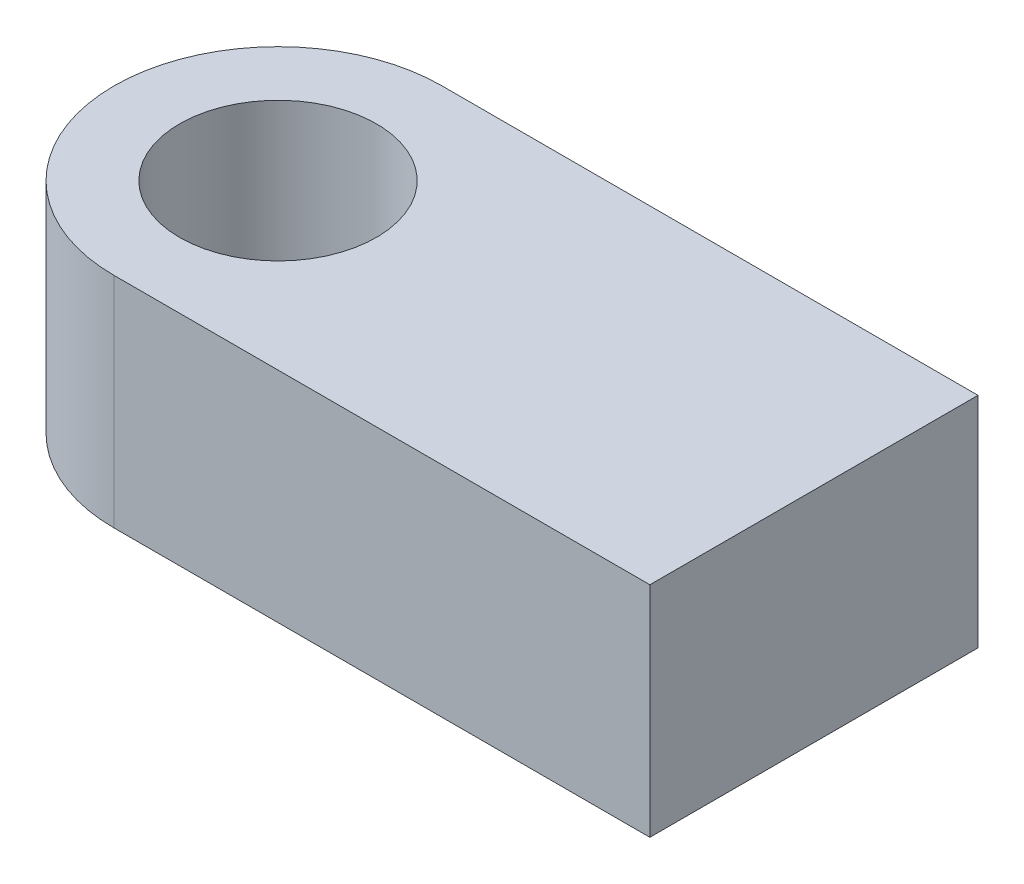
ISO-10303-21;
HEADER;
FILE_DESCRIPTION(('STEP AP214'),'2;1');
FILE_NAME('part.step','',(''),(''),'','','');
FILE_SCHEMA(('AUTOMOTIVE_DESIGN { 1 0 10303 214 1 1 1 1 }'));
ENDSEC;
DATA;
#1=APPLICATION_CONTEXT('core data for automotive mechanical design processes');
#2=APPLICATION_PROTOCOL_DEFINITION('international standard','automotive_design',2000,#1);
#3=PRODUCT_CONTEXT('',#1,'mechanical');
#4=PRODUCT('Part','Part','',(#3));
#5=PRODUCT_RELATED_PRODUCT_CATEGORY('part','',(#4));
#6=PRODUCT_DEFINITION_FORMATION('','',#4);
#7=PRODUCT_DEFINITION_CONTEXT('part definition',#1,'design');
#8=PRODUCT_DEFINITION('design','',#6,#7);
#9=PRODUCT_DEFINITION_SHAPE('','',#8);
#10=(LENGTH_UNIT() NAMED_UNIT(*) SI_UNIT(.MILLI.,.METRE.));
#11=(NAMED_UNIT(*) PLANE_ANGLE_UNIT() SI_UNIT($,.RADIAN.));
#12=(NAMED_UNIT(*) SI_UNIT($,.STERADIAN.) SOLID_ANGLE_UNIT());
#13=UNCERTAINTY_MEASURE_WITH_UNIT(LENGTH_MEASURE(1.E-05),#10,'distance_accuracy_value','');
#14=(GEOMETRIC_REPRESENTATION_CONTEXT(3) GLOBAL_UNCERTAINTY_ASSIGNED_CONTEXT((#13)) GLOBAL_UNIT_ASSIGNED_CONTEXT((#10,
#11,#12)) REPRESENTATION_CONTEXT('',''));
#15=CARTESIAN_POINT('',(0.,0.,0.));
#16=DIRECTION('',(0.,0.,1.));
#17=DIRECTION('',(1.,0.,0.));
#18=AXIS2_PLACEMENT_3D('',#15,#16,#17);
#19=CARTESIAN_POINT('',(0.,10.,0.));
#20=DIRECTION('',(0.,1.,0.));
#21=DIRECTION('',(0.,0.,1.));
#22=AXIS2_PLACEMENT_3D('',#19,#20,#21);
#23=PLANE('',#22);
#24=CARTESIAN_POINT('',(0.,10.,0.));
#25=DIRECTION('',(0.,1.,0.));
#26=DIRECTION('',(0.,0.,1.));
#27=AXIS2_PLACEMENT_3D('',#24,#25,#26);
#28=CIRCLE('',#27,7.5);
#29=CARTESIAN_POINT('',(0.,10.,-7.5));
#30=VERTEX_POINT('',#29);
#31=CARTESIAN_POINT('',(0.,10.,7.5));
#32=VERTEX_POINT('',#31);
#33=EDGE_CURVE('E96',#30,#32,#28,.T.);
#34=ORIENTED_EDGE('',*,*,#33,.T.);
#35=DIRECTION('',(1.,0.,0.));
#36=VECTOR('',#35,1.);
#37=CARTESIAN_POINT('',(24.5,10.,7.5));
#38=LINE('',#37,#36);
#39=CARTESIAN_POINT('',(24.5,10.,7.5));
#40=VERTEX_POINT('',#39);
#41=EDGE_CURVE('E91',#32,#40,#38,.T.);
#42=ORIENTED_EDGE('',*,*,#41,.T.);
#43=DIRECTION('',(0.,0.,-1.));
#44=VECTOR('',#43,1.);
#45=CARTESIAN_POINT('',(24.5,10.,7.5));
#46=LINE('',#45,#44);
#47=CARTESIAN_POINT('',(24.5,10.,-7.5));
#48=VERTEX_POINT('',#47);
#49=EDGE_CURVE('E94',#40,#48,#46,.T.);
#50=ORIENTED_EDGE('',*,*,#49,.T.);
#51=DIRECTION('',(-1.,0.,0.));
#52=VECTOR('',#51,1.);
#53=CARTESIAN_POINT('',(24.5,10.,-7.5));
#54=LINE('',#53,#52);
#55=EDGE_CURVE('E61',#48,#30,#54,.T.);
#56=ORIENTED_EDGE('',*,*,#55,.T.);
#57=EDGE_LOOP('',(#34,#42,#50,#56));
#58=FACE_BOUND('',#57,.T.);
#59=CARTESIAN_POINT('',(0.,10.,0.));
#60=DIRECTION('',(0.,1.,0.));
#61=DIRECTION('',(0.,0.,1.));
#62=AXIS2_PLACEMENT_3D('',#59,#60,#61);
#63=CIRCLE('',#62,4.5);
#64=CARTESIAN_POINT('',(0.,10.,4.5));
#65=VERTEX_POINT('',#64);
#66=EDGE_CURVE('E116',#65,#65,#63,.T.);
#67=ORIENTED_EDGE('',*,*,#66,.F.);
#68=EDGE_LOOP('',(#67));
#69=FACE_BOUND('',#68,.T.);
#70=ADVANCED_FACE('F43',(#58,#69),#23,.T.);
#71=CARTESIAN_POINT('',(0.,0.,0.));
#72=DIRECTION('',(0.,1.,0.));
#73=DIRECTION('',(0.,0.,1.));
#74=AXIS2_PLACEMENT_3D('',#71,#72,#73);
#75=PLANE('',#74);
#76=CARTESIAN_POINT('',(0.,0.,0.));
#77=DIRECTION('',(0.,1.,0.));
#78=DIRECTION('',(0.,0.,1.));
#79=AXIS2_PLACEMENT_3D('',#76,#77,#78);
#80=CIRCLE('',#79,7.5);
#81=CARTESIAN_POINT('',(0.,0.,-7.5));
#82=VERTEX_POINT('',#81);
#83=CARTESIAN_POINT('',(0.,0.,7.5));
#84=VERTEX_POINT('',#83);
#85=EDGE_CURVE('E112',#82,#84,#80,.T.);
#86=ORIENTED_EDGE('',*,*,#85,.F.);
#87=DIRECTION('',(-1.,0.,0.));
#88=VECTOR('',#87,1.);
#89=CARTESIAN_POINT('',(24.5,0.,-7.5));
#90=LINE('',#89,#88);
#91=CARTESIAN_POINT('',(24.5,0.,-7.5));
#92=VERTEX_POINT('',#91);
#93=EDGE_CURVE('E84',#92,#82,#90,.T.);
#94=ORIENTED_EDGE('',*,*,#93,.F.);
#95=DIRECTION('',(0.,0.,-1.));
#96=VECTOR('',#95,1.);
#97=CARTESIAN_POINT('',(24.5,0.,7.5));
#98=LINE('',#97,#96);
#99=CARTESIAN_POINT('',(24.5,0.,7.5));
#100=VERTEX_POINT('',#99);
#101=EDGE_CURVE('E78',#100,#92,#98,.T.);
#102=ORIENTED_EDGE('',*,*,#101,.F.);
#103=DIRECTION('',(1.,0.,0.));
#104=VECTOR('',#103,1.);
#105=CARTESIAN_POINT('',(24.5,0.,7.5));
#106=LINE('',#105,#104);
#107=EDGE_CURVE('E101',#84,#100,#106,.T.);
#108=ORIENTED_EDGE('',*,*,#107,.F.);
#109=EDGE_LOOP('',(#86,#94,#102,#108));
#110=FACE_BOUND('',#109,.T.);
#111=CARTESIAN_POINT('',(0.,0.,0.));
#112=DIRECTION('',(0.,1.,0.));
#113=DIRECTION('',(0.,0.,1.));
#114=AXIS2_PLACEMENT_3D('',#111,#112,#113);
#115=CIRCLE('',#114,4.5);
#116=CARTESIAN_POINT('',(0.,0.,4.5));
#117=VERTEX_POINT('',#116);
#118=EDGE_CURVE('E134',#117,#117,#115,.T.);
#119=ORIENTED_EDGE('',*,*,#118,.T.);
#120=EDGE_LOOP('',(#119));
#121=FACE_BOUND('',#120,.T.);
#122=ADVANCED_FACE('F129',(#110,#121),#75,.F.);
#123=CARTESIAN_POINT('',(0.,10.,0.));
#124=DIRECTION('',(0.,-1.,0.));
#125=DIRECTION('',(0.,0.,-1.));
#126=AXIS2_PLACEMENT_3D('',#123,#124,#125);
#127=CYLINDRICAL_SURFACE('',#126,7.5);
#128=ORIENTED_EDGE('',*,*,#85,.T.);
#129=DIRECTION('',(0.,-1.,0.));
#130=VECTOR('',#129,1.);
#131=CARTESIAN_POINT('',(0.,10.,7.5));
#132=LINE('',#131,#130);
#133=EDGE_CURVE('E11',#32,#84,#132,.T.);
#134=ORIENTED_EDGE('',*,*,#133,.F.);
#135=ORIENTED_EDGE('',*,*,#33,.F.);
#136=DIRECTION('',(0.,-1.,0.));
#137=VECTOR('',#136,1.);
#138=CARTESIAN_POINT('',(0.,10.,-7.5));
#139=LINE('',#138,#137);
#140=EDGE_CURVE('E108',#30,#82,#139,.T.);
#141=ORIENTED_EDGE('',*,*,#140,.T.);
#142=EDGE_LOOP('',(#128,#134,#135,#141));
#143=FACE_BOUND('',#142,.T.);
#144=ADVANCED_FACE('F45',(#143),#127,.T.);
#145=CARTESIAN_POINT('',(24.5,10.,7.5));
#146=DIRECTION('',(0.,0.,-1.));
#147=DIRECTION('',(-1.,0.,0.));
#148=AXIS2_PLACEMENT_3D('',#145,#146,#147);
#149=PLANE('',#148);
#150=ORIENTED_EDGE('',*,*,#107,.T.);
#151=DIRECTION('',(0.,-1.,0.));
#152=VECTOR('',#151,1.);
#153=CARTESIAN_POINT('',(24.5,10.,7.5));
#154=LINE('',#153,#152);
#155=EDGE_CURVE('E53',#40,#100,#154,.T.);
#156=ORIENTED_EDGE('',*,*,#155,.F.);
#157=ORIENTED_EDGE('',*,*,#41,.F.);
#158=ORIENTED_EDGE('',*,*,#133,.T.);
#159=EDGE_LOOP('',(#150,#156,#157,#158));
#160=FACE_BOUND('',#159,.T.);
#161=ADVANCED_FACE('F100',(#160),#149,.F.);
#162=CARTESIAN_POINT('',(24.5,10.,7.5));
#163=DIRECTION('',(-1.,0.,0.));
#164=DIRECTION('',(0.,0.,1.));
#165=AXIS2_PLACEMENT_3D('',#162,#163,#164);
#166=PLANE('',#165);
#167=ORIENTED_EDGE('',*,*,#101,.T.);
#168=DIRECTION('',(0.,-1.,0.));
#169=VECTOR('',#168,1.);
#170=CARTESIAN_POINT('',(24.5,10.,-7.5));
#171=LINE('',#170,#169);
#172=EDGE_CURVE('E103',#48,#92,#171,.T.);
#173=ORIENTED_EDGE('',*,*,#172,.F.);
#174=ORIENTED_EDGE('',*,*,#49,.F.);
#175=ORIENTED_EDGE('',*,*,#155,.T.);
#176=EDGE_LOOP('',(#167,#173,#174,#175));
#177=FACE_BOUND('',#176,.T.);
#178=ADVANCED_FACE('F104',(#177),#166,.F.);
#179=CARTESIAN_POINT('',(24.5,10.,-7.5));
#180=DIRECTION('',(0.,0.,1.));
#181=DIRECTION('',(1.,0.,0.));
#182=AXIS2_PLACEMENT_3D('',#179,#180,#181);
#183=PLANE('',#182);
#184=ORIENTED_EDGE('',*,*,#93,.T.);
#185=ORIENTED_EDGE('',*,*,#140,.F.);
#186=ORIENTED_EDGE('',*,*,#55,.F.);
#187=ORIENTED_EDGE('',*,*,#172,.T.);
#188=EDGE_LOOP('',(#184,#185,#186,#187));
#189=FACE_BOUND('',#188,.T.);
#190=ADVANCED_FACE('F126',(#189),#183,.F.);
#191=CARTESIAN_POINT('',(0.,10.,0.));
#192=DIRECTION('',(0.,-1.,0.));
#193=DIRECTION('',(0.,0.,-1.));
#194=AXIS2_PLACEMENT_3D('',#191,#192,#193);
#195=CYLINDRICAL_SURFACE('',#194,4.5);
#196=ORIENTED_EDGE('',*,*,#66,.T.);
#197=EDGE_LOOP('',(#196));
#198=FACE_BOUND('',#197,.T.);
#199=ORIENTED_EDGE('',*,*,#118,.F.);
#200=EDGE_LOOP('',(#199));
#201=FACE_BOUND('',#200,.T.);
#202=ADVANCED_FACE('F142',(#198,#201),#195,.F.);
#203=CLOSED_SHELL('',(#70,#122,#144,#161,#178,#190,#202));
#204=MANIFOLD_SOLID_BREP('B2',#203);
#205=ADVANCED_BREP_SHAPE_REPRESENTATION('',(#18,#204),#14);
#206=SHAPE_DEFINITION_REPRESENTATION(#9,#205);
ENDSEC;
END-ISO-10303-21;
